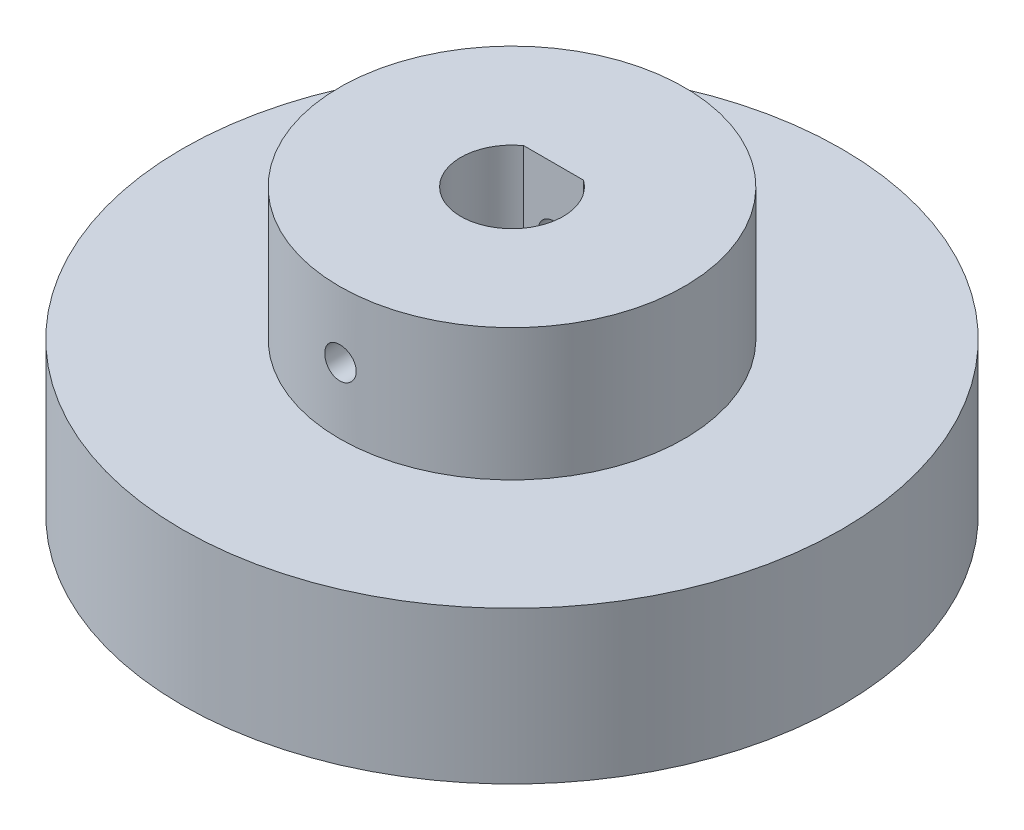
ISO-10303-21;
HEADER;
FILE_DESCRIPTION(('STEP AP214'),'2;1');
FILE_NAME('part.step','',(''),(''),'','','');
FILE_SCHEMA(('AUTOMOTIVE_DESIGN { 1 0 10303 214 1 1 1 1 }'));
ENDSEC;
DATA;
#1=APPLICATION_CONTEXT('core data for automotive mechanical design processes');
#2=APPLICATION_PROTOCOL_DEFINITION('international standard','automotive_design',2000,#1);
#3=PRODUCT_CONTEXT('',#1,'mechanical');
#4=PRODUCT('Part','Part','',(#3));
#5=PRODUCT_RELATED_PRODUCT_CATEGORY('part','',(#4));
#6=PRODUCT_DEFINITION_FORMATION('','',#4);
#7=PRODUCT_DEFINITION_CONTEXT('part definition',#1,'design');
#8=PRODUCT_DEFINITION('design','',#6,#7);
#9=PRODUCT_DEFINITION_SHAPE('','',#8);
#10=(LENGTH_UNIT() NAMED_UNIT(*) SI_UNIT(.MILLI.,.METRE.));
#11=(NAMED_UNIT(*) PLANE_ANGLE_UNIT() SI_UNIT($,.RADIAN.));
#12=(NAMED_UNIT(*) SI_UNIT($,.STERADIAN.) SOLID_ANGLE_UNIT());
#13=UNCERTAINTY_MEASURE_WITH_UNIT(LENGTH_MEASURE(1.E-05),#10,'distance_accuracy_value','');
#14=(GEOMETRIC_REPRESENTATION_CONTEXT(3) GLOBAL_UNCERTAINTY_ASSIGNED_CONTEXT((#13)) GLOBAL_UNIT_ASSIGNED_CONTEXT((#10,
#11,#12)) REPRESENTATION_CONTEXT('',''));
#15=CARTESIAN_POINT('',(0.,0.,0.));
#16=DIRECTION('',(0.,0.,1.));
#17=DIRECTION('',(1.,0.,0.));
#18=AXIS2_PLACEMENT_3D('',#15,#16,#17);
#19=CARTESIAN_POINT('',(0.0223703761253122,21.5,-32.5));
#20=DIRECTION('',(0.,0.,1.));
#21=DIRECTION('',(1.,0.,0.));
#22=AXIS2_PLACEMENT_3D('',#19,#20,#21);
#23=CYLINDRICAL_SURFACE('',#22,1.55);
#24=CARTESIAN_POINT('',(1.57237037612531,21.5,4.79897399454129));
#25=CARTESIAN_POINT('',(1.57236958554526,21.415245112854,4.79897468549828));
#26=CARTESIAN_POINT('',(1.56539491467317,21.3304823688655,4.80127644397122));
#27=CARTESIAN_POINT('',(1.53775875516251,21.1634440908538,4.81019780807847));
#28=CARTESIAN_POINT('',(1.51709314240551,21.0811693140913,4.81681871475932));
#29=CARTESIAN_POINT('',(1.46285396931085,20.9215525691871,4.83356548686396));
#30=CARTESIAN_POINT('',(1.42930316875579,20.8442021821046,4.84368516909074));
#31=CARTESIAN_POINT('',(1.35032356496765,20.6962092904023,4.86629295757356));
#32=CARTESIAN_POINT('',(1.30489276946151,20.6255679135934,4.87878146098394));
#33=CARTESIAN_POINT('',(1.20179053880469,20.4905941236095,4.90521266106346));
#34=CARTESIAN_POINT('',(1.14378480103254,20.426523478463,4.91918832794817));
#35=CARTESIAN_POINT('',(1.01789724733333,20.3088442005661,4.94676984753791));
#36=CARTESIAN_POINT('',(0.95001402931524,20.255237055625,4.960375647415));
#37=CARTESIAN_POINT('',(0.804371403675687,20.1588165257837,4.98608775331599));
#38=CARTESIAN_POINT('',(0.726420470532028,20.1162803122584,4.99815228427005));
#39=CARTESIAN_POINT('',(0.56403799125583,20.0450250246475,5.01906873581553));
#40=CARTESIAN_POINT('',(0.479607897562207,20.0163028642849,5.02792137388578));
#41=CARTESIAN_POINT('',(0.309312844167433,19.9743445301574,5.0412201368812));
#42=CARTESIAN_POINT('',(0.223564464358488,19.9606748502213,5.0457890188633));
#43=CARTESIAN_POINT('',(0.0508764378845257,19.9478468880424,5.05048168839274));
#44=CARTESIAN_POINT('',(-0.0360629344679921,19.9486853185907,5.05060648284997));
#45=CARTESIAN_POINT('',(-0.205503852231969,19.9645629012171,5.04650467193481));
#46=CARTESIAN_POINT('',(-0.288055375261147,19.9791143887754,5.04242704890238));
#47=CARTESIAN_POINT('',(-0.449493142819145,20.0212150463591,5.03060735909615));
#48=CARTESIAN_POINT('',(-0.528379171497621,20.0487649807624,5.02286507682075));
#49=CARTESIAN_POINT('',(-0.681252408272383,20.1163539116386,5.00443726482751));
#50=CARTESIAN_POINT('',(-0.755177580786521,20.1565244451335,4.99372088177117));
#51=CARTESIAN_POINT('',(-0.895390769856976,20.2481090976139,4.97049630395242));
#52=CARTESIAN_POINT('',(-0.961676937860915,20.2995259293889,4.95798767712328));
#53=CARTESIAN_POINT('',(-1.08751550858931,20.414548720774,4.93194745720397));
#54=CARTESIAN_POINT('',(-1.14669536187313,20.478558054921,4.918394965272));
#55=CARTESIAN_POINT('',(-1.25359530094817,20.6157081285505,4.89224236041931));
#56=CARTESIAN_POINT('',(-1.30131411044558,20.6888498836359,4.87964235367363));
#57=CARTESIAN_POINT('',(-1.38438978391308,20.843269704996,4.85673248512194));
#58=CARTESIAN_POINT('',(-1.41960339049295,20.9246291503289,4.84644962707734));
#59=CARTESIAN_POINT('',(-1.47571989170823,21.0925059162829,4.82966028921734));
#60=CARTESIAN_POINT('',(-1.49662753171737,21.1790215162152,4.8231525572794));
#61=CARTESIAN_POINT('',(-1.52284366888667,21.3512805927124,4.81493822038719));
#62=CARTESIAN_POINT('',(-1.52870750523541,21.4369314539227,4.81306079453928));
#63=CARTESIAN_POINT('',(-1.52622613541838,21.6079980310199,4.81384839018644));
#64=CARTESIAN_POINT('',(-1.51788298974906,21.6934137792067,4.81651275296748));
#65=CARTESIAN_POINT('',(-1.48772560866184,21.8591927026371,4.82591005186149));
#66=CARTESIAN_POINT('',(-1.46628049765534,21.9396300076588,4.83253139907249));
#67=CARTESIAN_POINT('',(-1.41095936316689,22.0957584690525,4.84897110778581));
#68=CARTESIAN_POINT('',(-1.37708138846456,22.1714488782597,4.8587899710808));
#69=CARTESIAN_POINT('',(-1.296805497858,22.3182050431409,4.88083680827539));
#70=CARTESIAN_POINT('',(-1.2500931129838,22.3890898348057,4.89312286834615));
#71=CARTESIAN_POINT('',(-1.14584018015968,22.5222212873612,4.91857951466367));
#72=CARTESIAN_POINT('',(-1.08829698718215,22.5844658317231,4.93175031646981));
#73=CARTESIAN_POINT('',(-0.961380494826282,22.7010149975381,4.95808424080737));
#74=CARTESIAN_POINT('',(-0.891637561241767,22.7549225837495,4.97122761855533));
#75=CARTESIAN_POINT('',(-0.743774720047935,22.8502810136936,4.99548832362483));
#76=CARTESIAN_POINT('',(-0.665655269968326,22.8917325373132,5.00660576151482));
#77=CARTESIAN_POINT('',(-0.503824430379552,22.9605769238491,5.02545872196002));
#78=CARTESIAN_POINT('',(-0.42016461099625,22.9880831818748,5.03322144422541));
#79=CARTESIAN_POINT('',(-0.249133552553757,23.0285620458291,5.04457791753595));
#80=CARTESIAN_POINT('',(-0.161763423240296,23.0415389661138,5.04817290616335));
#81=CARTESIAN_POINT('',(0.0104751742066859,23.0522588080119,5.0506945390149));
#82=CARTESIAN_POINT('',(0.0953050576053584,23.0505866984308,5.04980104546167));
#83=CARTESIAN_POINT('',(0.26340620193087,23.0334727239293,5.04382695603063));
#84=CARTESIAN_POINT('',(0.346677548357741,23.0180316166386,5.03874659053375));
#85=CARTESIAN_POINT('',(0.5084484834259,22.9741709878761,5.02498830543929));
#86=CARTESIAN_POINT('',(0.586989126143305,22.9458900205654,5.01634888134025));
#87=CARTESIAN_POINT('',(0.738243292571166,22.8772892321993,4.99633103163847));
#88=CARTESIAN_POINT('',(0.81095580468008,22.8369673268866,4.98495213190525));
#89=CARTESIAN_POINT('',(0.95117273254936,22.7438439982115,4.96014258619357));
#90=CARTESIAN_POINT('',(1.01841659467454,22.6906654374254,4.9466554075872));
#91=CARTESIAN_POINT('',(1.14322056559452,22.5740088436691,4.91931260332016));
#92=CARTESIAN_POINT('',(1.20077778284635,22.5105277463761,4.90545686906693));
#93=CARTESIAN_POINT('',(1.30640372500294,22.3726591002222,4.87840965396929));
#94=CARTESIAN_POINT('',(1.35411551697679,22.2979904956721,4.86525295500199));
#95=CARTESIAN_POINT('',(1.43625135952634,22.1412930734516,4.84164421670365));
#96=CARTESIAN_POINT('',(1.47068140462494,22.0592675968495,4.83119095791804));
#97=CARTESIAN_POINT('',(1.52244480658989,21.8983842070706,4.81511418166048));
#98=CARTESIAN_POINT('',(1.54111305144592,21.8199913828648,4.8091204098642));
#99=CARTESIAN_POINT('',(1.5660747817327,21.661067738215,4.80105044075344));
#100=CARTESIAN_POINT('',(1.57237112736547,21.5805374162933,4.79897333796688));
#101=CARTESIAN_POINT('',(1.57237037612531,21.5,4.79897399454129));
#102=B_SPLINE_CURVE_WITH_KNOTS('',3,(#24,#25,#26,#27,#28,#29,#30,#31,#32,#33,#34,#35,#36,#37,
#38,#39,#40,#41,#42,#43,#44,#45,#46,#47,#48,#49,#50,#51,#52,#53,#54,#55,#56,#57,#58,#59,#60,#61,
#62,#63,#64,#65,#66,#67,#68,#69,#70,#71,#72,#73,#74,#75,#76,#77,#78,#79,#80,#81,#82,#83,#84,#85,
#86,#87,#88,#89,#90,#91,#92,#93,#94,#95,#96,#97,#98,#99,#100,#101),.UNSPECIFIED.,.T.,.F.,(4,2,2,
2,2,2,2,2,2,2,2,2,2,2,2,2,2,2,2,2,2,2,2,2,2,2,2,2,2,2,2,2,2,2,2,2,2,2,4),(0.,0.253967035051624,
0.50801060732502,0.761607497756715,1.01524694364658,1.27670891970874,1.53820804611307,
1.80573262972291,2.07319741632902,2.33273969270848,2.5922231634627,2.84281375145303,
3.09341907734421,3.34672817173041,3.60009843589626,3.86354324925393,4.12701738605336,
4.39341923367813,4.65973267134037,4.91606366919113,5.17235749347987,5.42174385132853,
5.67116936475667,5.92735568440751,6.18360464953735,6.44970080365817,6.71578243086454,
6.97966425988961,7.24346771078181,7.49678642882717,7.7500912090444,8.00072527536826,
8.25140275101785,8.51058900074705,8.76985248299288,9.03730122887668,9.30462912404237,
9.54601436796691,9.78734380058715),.UNSPECIFIED.);
#103=CARTESIAN_POINT('',(1.57237037612531,21.5,4.79897399454129));
#104=VERTEX_POINT('',#103);
#105=EDGE_CURVE('E49',#104,#104,#102,.T.);
#106=ORIENTED_EDGE('',*,*,#105,.T.);
#107=EDGE_LOOP('',(#106));
#108=FACE_BOUND('',#107,.T.);
#109=CARTESIAN_POINT('',(1.57237037612531,21.5,16.9271276772016));
#110=CARTESIAN_POINT('',(1.57236659389507,21.4131369375683,16.9271286160672));
#111=CARTESIAN_POINT('',(1.56504398477038,21.3262154967159,16.927813181358));
#112=CARTESIAN_POINT('',(1.53594190994299,21.1547800174531,16.9304780710943));
#113=CARTESIAN_POINT('',(1.51414626348175,21.0702687840551,16.9324598457757));
#114=CARTESIAN_POINT('',(1.45673617165203,20.9061615515706,16.9374952407345));
#115=CARTESIAN_POINT('',(1.42112985250021,20.8265626939016,16.940548230607));
#116=CARTESIAN_POINT('',(1.33712440190627,20.6744895173705,16.9473852188164));
#117=CARTESIAN_POINT('',(1.28872791268835,20.6020137312446,16.9511690661276));
#118=CARTESIAN_POINT('',(1.18035334523799,20.4659994240568,16.9590600353723));
#119=CARTESIAN_POINT('',(1.12034350157623,20.4024862613564,16.9631680252336));
#120=CARTESIAN_POINT('',(0.990513462193653,20.2864179378318,16.9712434605172));
#121=CARTESIAN_POINT('',(0.920692823059478,20.2338632725599,16.9752108995768));
#122=CARTESIAN_POINT('',(0.773065204461031,20.1411144322338,16.9825744188427));
#123=CARTESIAN_POINT('',(0.69524375509448,20.1009431969604,16.9859694334507));
#124=CARTESIAN_POINT('',(0.533924077228444,20.0342474739556,16.9918048674329));
#125=CARTESIAN_POINT('',(0.450425964354821,20.0077227083585,16.9942453062438));
#126=CARTESIAN_POINT('',(0.280369303411096,19.9691449324961,16.9978999387046));
#127=CARTESIAN_POINT('',(0.193819920936012,19.9570518458503,16.9991175266794));
#128=CARTESIAN_POINT('',(0.0199116339372413,19.9475576927308,17.0002106846626));
#129=CARTESIAN_POINT('',(-0.067447252436503,19.9501562976456,17.0000862846875));
#130=CARTESIAN_POINT('',(-0.24021317022814,19.9699389179667,16.9985217032571));
#131=CARTESIAN_POINT('',(-0.325625351731892,19.9870783250333,16.9970855449887));
#132=CARTESIAN_POINT('',(-0.49235654375369,20.0353875218312,16.9930734075619));
#133=CARTESIAN_POINT('',(-0.573675511612227,20.0665574577552,16.9904974165269));
#134=CARTESIAN_POINT('',(-0.730039912174668,20.142086965524,16.984498185009));
#135=CARTESIAN_POINT('',(-0.805076648995674,20.1864644447953,16.9810737952892));
#136=CARTESIAN_POINT('',(-0.946653410689705,20.2871364137624,16.9737703628239));
#137=CARTESIAN_POINT('',(-1.01319323112513,20.3434311901042,16.9698913091435));
#138=CARTESIAN_POINT('',(-1.13613895409048,20.4665815858029,16.9621049668005));
#139=CARTESIAN_POINT('',(-1.19250742075607,20.5334745820691,16.9581976267623));
#140=CARTESIAN_POINT('',(-1.29322123653205,20.6757924486167,16.9508152319073));
#141=CARTESIAN_POINT('',(-1.33756656785388,20.7512173315209,16.9473401777301));
#142=CARTESIAN_POINT('',(-1.41297793258579,20.9084915223495,16.9412199119909));
#143=CARTESIAN_POINT('',(-1.44404083408563,20.9903423400883,16.9385748961856));
#144=CARTESIAN_POINT('',(-1.49197252860717,21.1581267407615,16.9344206245236));
#145=CARTESIAN_POINT('',(-1.50884166956168,21.2440602235628,16.9329113408267));
#146=CARTESIAN_POINT('',(-1.52786031686174,21.4172500365577,16.9312059669392));
#147=CARTESIAN_POINT('',(-1.53006091510152,21.5045007130984,16.9310053187027));
#148=CARTESIAN_POINT('',(-1.51981400386119,21.6781296444101,16.9319281483244));
#149=CARTESIAN_POINT('',(-1.50736665369941,21.7645079086597,16.9330516117808));
#150=CARTESIAN_POINT('',(-1.46822013129412,21.9337911593816,16.9364905064848));
#151=CARTESIAN_POINT('',(-1.44154514252187,22.0167017828618,16.9388039148828));
#152=CARTESIAN_POINT('',(-1.37472504960469,22.1768711626123,16.9443574224888));
#153=CARTESIAN_POINT('',(-1.33457969213555,22.2541298125582,16.9475975391244));
#154=CARTESIAN_POINT('',(-1.24182861900553,22.4010371413398,16.9546460471866));
#155=CARTESIAN_POINT('',(-1.18918869720926,22.4706641484312,16.9584559878271));
#156=CARTESIAN_POINT('',(-1.07299175906612,22.6001121643713,16.9662037685859));
#157=CARTESIAN_POINT('',(-1.00943452558874,22.6599329781419,16.9701416112467));
#158=CARTESIAN_POINT('',(-0.872987085440025,22.7682443807546,16.9777079357463));
#159=CARTESIAN_POINT('',(-0.800070599146281,22.8167019363281,16.9813354966358));
#160=CARTESIAN_POINT('',(-0.647104976640854,22.9006838791462,16.9878517596939));
#161=CARTESIAN_POINT('',(-0.567055926591044,22.9362084225962,16.9907404707861));
#162=CARTESIAN_POINT('',(-0.402223828917303,22.9932561067523,16.9954404972137));
#163=CARTESIAN_POINT('',(-0.317448339553714,23.0148009430332,16.9972534816291));
#164=CARTESIAN_POINT('',(-0.145466577955602,23.0433497597573,16.9995950455456));
#165=CARTESIAN_POINT('',(-0.0582603610377505,23.0503540708296,17.0001236542514));
#166=CARTESIAN_POINT('',(0.115775122087311,23.0496196257761,16.9998277007759));
#167=CARTESIAN_POINT('',(0.202604623089837,23.0419333822634,16.9990079598428));
#168=CARTESIAN_POINT('',(0.373732576635567,23.012146711158,16.9961069161588));
#169=CARTESIAN_POINT('',(0.458031024644318,22.9900462577436,16.9940256111479));
#170=CARTESIAN_POINT('',(0.621715811673158,22.9320698258438,16.9888251634667));
#171=CARTESIAN_POINT('',(0.701102044479991,22.8961935496145,16.9857059983647));
#172=CARTESIAN_POINT('',(0.852733337689036,22.8116900147118,16.9787694960184));
#173=CARTESIAN_POINT('',(0.924978475595245,22.7630628944471,16.9749521663526));
#174=CARTESIAN_POINT('',(1.0605550086033,22.6542338742117,16.9670226863364));
#175=CARTESIAN_POINT('',(1.12385395307,22.5939916200512,16.962909540424));
#176=CARTESIAN_POINT('',(1.23946961145082,22.4637191814367,16.9548542675677));
#177=CARTESIAN_POINT('',(1.29178367498071,22.3936866415992,16.9509121820782));
#178=CARTESIAN_POINT('',(1.38402788969073,22.2456627497164,16.9436306310379));
#179=CARTESIAN_POINT('',(1.42393150258732,22.167654809799,16.9402924631794));
#180=CARTESIAN_POINT('',(1.49002143558513,22.0060663925217,16.93460795458));
#181=CARTESIAN_POINT('',(1.51622340664177,21.9224923967086,16.9322604827924));
#182=CARTESIAN_POINT('',(1.54755282831842,21.7820280343358,16.9294188937738));
#183=CARTESIAN_POINT('',(1.55684687414475,21.7260391782835,16.9285636481783));
#184=CARTESIAN_POINT('',(1.56925687186279,21.6133751713036,16.927417734439));
#185=CARTESIAN_POINT('',(1.57237284498301,21.556700022735,16.9271270643553));
#186=CARTESIAN_POINT('',(1.57237037612531,21.5,16.9271276772016));
#187=B_SPLINE_CURVE_WITH_KNOTS('',3,(#109,#110,#111,#112,#113,#114,#115,#116,#117,#118,#119,
#120,#121,#122,#123,#124,#125,#126,#127,#128,#129,#130,#131,#132,#133,#134,#135,#136,#137,#138,
#139,#140,#141,#142,#143,#144,#145,#146,#147,#148,#149,#150,#151,#152,#153,#154,#155,#156,#157,
#158,#159,#160,#161,#162,#163,#164,#165,#166,#167,#168,#169,#170,#171,#172,#173,#174,#175,#176,
#177,#178,#179,#180,#181,#182,#183,#184,#185,#186),.UNSPECIFIED.,.T.,.F.,(4,2,2,2,2,2,2,2,2,2,2,
2,2,2,2,2,2,2,2,2,2,2,2,2,2,2,2,2,2,2,2,2,2,2,2,2,2,2,4),(0.,0.26038213175405,0.521055860205023,
0.781576440027273,1.04204324289158,1.3032328227842,1.56443421132373,1.82611659636994,
2.0877936529003,2.34874233572794,2.60968518189573,2.86983038913284,3.12997830704442,
3.3904805655557,3.65098909062576,3.9124376898775,4.17388667594743,4.43539727603145,
4.69690146549774,4.95749433350996,5.2180843672117,5.47823286722952,5.7383862598834,
5.99926025563522,6.26013944041727,6.52176785764677,6.78339311481494,7.04461136968713,
7.30582368479613,7.5661040207032,7.82638482288196,8.08667125095797,8.34695485377339,
8.60815960201618,8.86942730037112,9.13124990738562,9.3927727857402,9.56273828208302,
9.73270319440525),.UNSPECIFIED.);
#188=CARTESIAN_POINT('',(1.57237037612531,21.5,16.9271276772016));
#189=VERTEX_POINT('',#188);
#190=EDGE_CURVE('E118',#189,#189,#187,.T.);
#191=ORIENTED_EDGE('',*,*,#190,.F.);
#192=EDGE_LOOP('',(#191));
#193=FACE_BOUND('',#192,.T.);
#194=ADVANCED_FACE('F45',(#108,#193),#23,.F.);
#195=CARTESIAN_POINT('',(0.,15.,0.));
#196=DIRECTION('',(0.,-1.,0.));
#197=DIRECTION('',(0.,0.,-1.));
#198=AXIS2_PLACEMENT_3D('',#195,#196,#197);
#199=CYLINDRICAL_SURFACE('',#198,32.5);
#200=CARTESIAN_POINT('',(0.,15.,0.));
#201=DIRECTION('',(0.,1.,0.));
#202=DIRECTION('',(0.,0.,1.));
#203=AXIS2_PLACEMENT_3D('',#200,#201,#202);
#204=CIRCLE('',#203,32.5);
#205=CARTESIAN_POINT('',(0.,15.,32.5));
#206=VERTEX_POINT('',#205);
#207=EDGE_CURVE('E60',#206,#206,#204,.T.);
#208=ORIENTED_EDGE('',*,*,#207,.F.);
#209=EDGE_LOOP('',(#208));
#210=FACE_BOUND('',#209,.T.);
#211=CARTESIAN_POINT('',(0.,0.,0.));
#212=DIRECTION('',(0.,1.,0.));
#213=DIRECTION('',(0.,0.,1.));
#214=AXIS2_PLACEMENT_3D('',#211,#212,#213);
#215=CIRCLE('',#214,32.5);
#216=CARTESIAN_POINT('',(0.,0.,32.5));
#217=VERTEX_POINT('',#216);
#218=EDGE_CURVE('E109',#217,#217,#215,.T.);
#219=ORIENTED_EDGE('',*,*,#218,.T.);
#220=EDGE_LOOP('',(#219));
#221=FACE_BOUND('',#220,.T.);
#222=ADVANCED_FACE('F47',(#210,#221),#199,.T.);
#223=CARTESIAN_POINT('',(0.,15.,0.));
#224=DIRECTION('',(0.,1.,0.));
#225=DIRECTION('',(0.,0.,1.));
#226=AXIS2_PLACEMENT_3D('',#223,#224,#225);
#227=PLANE('',#226);
#228=CARTESIAN_POINT('',(0.,15.,0.));
#229=DIRECTION('',(0.,1.,0.));
#230=DIRECTION('',(0.,0.,1.));
#231=AXIS2_PLACEMENT_3D('',#228,#229,#230);
#232=CIRCLE('',#231,17.);
#233=CARTESIAN_POINT('',(0.,15.,17.));
#234=VERTEX_POINT('',#233);
#235=EDGE_CURVE('E11',#234,#234,#232,.T.);
#236=ORIENTED_EDGE('',*,*,#235,.F.);
#237=EDGE_LOOP('',(#236));
#238=FACE_BOUND('',#237,.T.);
#239=ORIENTED_EDGE('',*,*,#207,.T.);
#240=EDGE_LOOP('',(#239));
#241=FACE_BOUND('',#240,.T.);
#242=ADVANCED_FACE('F153',(#238,#241),#227,.T.);
#243=CARTESIAN_POINT('',(0.,0.,0.));
#244=DIRECTION('',(0.,1.,0.));
#245=DIRECTION('',(0.,0.,1.));
#246=AXIS2_PLACEMENT_3D('',#243,#244,#245);
#247=PLANE('',#246);
#248=DIRECTION('',(-1.,0.,0.));
#249=VECTOR('',#248,1.);
#250=CARTESIAN_POINT('',(-2.94830459756111,0.,-4.1));
#251=LINE('',#250,#249);
#252=CARTESIAN_POINT('',(2.94830459756111,0.,-4.1));
#253=VERTEX_POINT('',#252);
#254=CARTESIAN_POINT('',(-2.94830459756111,0.,-4.1));
#255=VERTEX_POINT('',#254);
#256=EDGE_CURVE('E101',#253,#255,#251,.T.);
#257=ORIENTED_EDGE('',*,*,#256,.T.);
#258=CARTESIAN_POINT('',(0.,0.,0.));
#259=DIRECTION('',(0.,1.,0.));
#260=DIRECTION('',(0.,0.,1.));
#261=AXIS2_PLACEMENT_3D('',#258,#259,#260);
#262=CIRCLE('',#261,5.05);
#263=EDGE_CURVE('E68',#255,#253,#262,.T.);
#264=ORIENTED_EDGE('',*,*,#263,.T.);
#265=EDGE_LOOP('',(#257,#264));
#266=FACE_BOUND('',#265,.T.);
#267=ORIENTED_EDGE('',*,*,#218,.F.);
#268=EDGE_LOOP('',(#267));
#269=FACE_BOUND('',#268,.T.);
#270=ADVANCED_FACE('F146',(#266,#269),#247,.F.);
#271=CARTESIAN_POINT('',(0.,28.,0.));
#272=DIRECTION('',(0.,-1.,0.));
#273=DIRECTION('',(0.,0.,-1.));
#274=AXIS2_PLACEMENT_3D('',#271,#272,#273);
#275=CYLINDRICAL_SURFACE('',#274,17.);
#276=CARTESIAN_POINT('',(0.,23.0498385613579,-17.));
#277=CARTESIAN_POINT('',(-0.0868663682931145,23.0485809508992,-16.999999085948));
#278=CARTESIAN_POINT('',(-0.173685468166951,23.0400023564061,-16.9993271238898));
#279=CARTESIAN_POINT('',(-0.344707744601173,23.0084202134858,-16.9967207129575));
#280=CARTESIAN_POINT('',(-0.42890787985605,22.9854005067209,-16.9947848497898));
#281=CARTESIAN_POINT('',(-0.592193791399683,22.9256096159576,-16.9898786232765));
#282=CARTESIAN_POINT('',(-0.671282521761873,22.8888464596986,-16.9869088639134));
#283=CARTESIAN_POINT('',(-0.822149705144904,22.8026259785611,-16.9802761854882));
#284=CARTESIAN_POINT('',(-0.893929672152452,22.7531712901952,-16.9766134104332));
#285=CARTESIAN_POINT('',(-1.02837517106396,22.642811113036,-16.9690010952066));
#286=CARTESIAN_POINT('',(-1.09101587904835,22.5818754306477,-16.9650508161402));
#287=CARTESIAN_POINT('',(-1.20519527854581,22.4503509730346,-16.9573225431791));
#288=CARTESIAN_POINT('',(-1.25673348281833,22.3797617743811,-16.9535445568514));
#289=CARTESIAN_POINT('',(-1.34732006017426,22.2307936577936,-16.9465867876863));
#290=CARTESIAN_POINT('',(-1.38634818747452,22.1524023792569,-16.9434079779213));
#291=CARTESIAN_POINT('',(-1.45067859753249,21.9901455896372,-16.9380217296697));
#292=CARTESIAN_POINT('',(-1.47598116932735,21.9062801938715,-16.9358142707283));
#293=CARTESIAN_POINT('',(-1.51207411902391,21.7357075294853,-16.9326301218829));
#294=CARTESIAN_POINT('',(-1.52290529221666,21.6490089585169,-16.9316499726502));
#295=CARTESIAN_POINT('',(-1.52987181906255,21.4750196072453,-16.9310219822187));
#296=CARTESIAN_POINT('',(-1.52600747647035,21.3877288392199,-16.9313741134818));
#297=CARTESIAN_POINT('',(-1.50372835769849,21.215290333189,-16.9333671492474));
#298=CARTESIAN_POINT('',(-1.48535442998087,21.1301372703261,-16.9350044356081));
#299=CARTESIAN_POINT('',(-1.43463824446335,20.9641278299129,-16.9393758951382));
#300=CARTESIAN_POINT('',(-1.40229581084244,20.8832715064599,-16.9421100821141));
#301=CARTESIAN_POINT('',(-1.32450288027309,20.7279991697681,-16.9483689478146));
#302=CARTESIAN_POINT('',(-1.27903088386855,20.6535939821276,-16.9518949209545));
#303=CARTESIAN_POINT('',(-1.17628646735206,20.513454987625,-16.9593335544481));
#304=CARTESIAN_POINT('',(-1.11901377168353,20.4477213833107,-16.9632462238303));
#305=CARTESIAN_POINT('',(-0.994054027222122,20.3265512417602,-16.971027666463));
#306=CARTESIAN_POINT('',(-0.926331193461506,20.2711515885173,-16.9748962378881));
#307=CARTESIAN_POINT('',(-0.782524081456846,20.1725031739418,-16.9821326906381));
#308=CARTESIAN_POINT('',(-0.706439813245747,20.1292543980295,-16.9855005725637));
#309=CARTESIAN_POINT('',(-0.548069499840979,20.0561498462738,-16.9913475211865));
#310=CARTESIAN_POINT('',(-0.465784437841992,20.0262919523763,-16.9938267284341));
#311=CARTESIAN_POINT('',(-0.297342125297643,19.9808247554211,-16.9976080434278));
#312=CARTESIAN_POINT('',(-0.211184971833435,19.9652150953404,-16.9989101806683));
#313=CARTESIAN_POINT('',(-0.0377761503553451,19.9487292819703,-17.0001783139702));
#314=CARTESIAN_POINT('',(0.049470466595981,19.9478003397034,-17.0001490987864));
#315=CARTESIAN_POINT('',(0.222875484735024,19.9605664554429,-16.9987601143463));
#316=CARTESIAN_POINT('',(0.309033895989288,19.9742613780695,-16.9974003574073));
#317=CARTESIAN_POINT('',(0.477694910982847,20.0158459758613,-16.9934963325209));
#318=CARTESIAN_POINT('',(0.560202505374396,20.0437155789388,-16.9909537399636));
#319=CARTESIAN_POINT('',(0.719371316140834,20.1128380454341,-16.9849596522805));
#320=CARTESIAN_POINT('',(0.796032413917998,20.1540911802513,-16.9815081387233));
#321=CARTESIAN_POINT('',(0.941585711299555,20.248955553168,-16.9740611150498));
#322=CARTESIAN_POINT('',(1.01045372236244,20.3026037766344,-16.9700639918089));
#323=CARTESIAN_POINT('',(1.138224988508,20.4206781762,-16.9619736688199));
#324=CARTESIAN_POINT('',(1.19712804462412,20.485104567452,-16.9578804671553));
#325=CARTESIAN_POINT('',(1.30346565906355,20.6231273864907,-16.9500394218847));
#326=CARTESIAN_POINT('',(1.35086720639278,20.6967493117131,-16.9462925910282));
#327=CARTESIAN_POINT('',(1.43263202076886,20.8509414870109,-16.9395766181439));
#328=CARTESIAN_POINT('',(1.46699546577037,20.9315116422327,-16.9366074655019));
#329=CARTESIAN_POINT('',(1.52164288769805,21.0971660949246,-16.9317854809396));
#330=CARTESIAN_POINT('',(1.54195188712807,21.182242077887,-16.9299306658359));
#331=CARTESIAN_POINT('',(1.56799644497224,21.3546137842347,-16.9275385453363));
#332=CARTESIAN_POINT('',(1.57373234867621,21.4419094549781,-16.9270012087247));
#333=CARTESIAN_POINT('',(1.5704694043828,21.6158971795699,-16.9273042093683));
#334=CARTESIAN_POINT('',(1.56152512794903,21.7025902713369,-16.9281394442908));
#335=CARTESIAN_POINT('',(1.5292659843916,21.8732371366565,-16.9310839713611));
#336=CARTESIAN_POINT('',(1.50595107793421,21.9571909027105,-16.9331932669961));
#337=CARTESIAN_POINT('',(1.44562035013057,22.1199977633744,-16.938450125427));
#338=CARTESIAN_POINT('',(1.40860277290617,22.1988502027716,-16.9415978212791));
#339=CARTESIAN_POINT('',(1.32192319485193,22.3492317641018,-16.9485811093666));
#340=CARTESIAN_POINT('',(1.27226132425316,22.4207609614506,-16.9524166945168));
#341=CARTESIAN_POINT('',(1.16148740198865,22.5547493530566,-16.9603665459843));
#342=CARTESIAN_POINT('',(1.10033413173983,22.6171744135455,-16.9644817803561));
#343=CARTESIAN_POINT('',(0.968397796387734,22.7309013347817,-16.9725238065442));
#344=CARTESIAN_POINT('',(0.897612421819803,22.7822005202321,-16.9764505528609));
#345=CARTESIAN_POINT('',(0.748266416282966,22.8722969603401,-16.9836890649089));
#346=CARTESIAN_POINT('',(0.669690076796141,22.9110682571304,-16.9869995478019));
#347=CARTESIAN_POINT('',(0.507164095422734,22.9748144904732,-16.9926269115898));
#348=CARTESIAN_POINT('',(0.423220705134557,22.9998051635286,-16.9949449251354));
#349=CARTESIAN_POINT('',(0.282325152106081,23.0290991276144,-16.9977466507787));
#350=CARTESIAN_POINT('',(0.226214092655529,23.0375821435074,-16.9985884447549));
#351=CARTESIAN_POINT('',(0.113395310776075,23.0483621979464,-16.9997154166614));
#352=CARTESIAN_POINT('',(0.0566875903887748,23.0506592576522,-17.0000005964956));
#353=CARTESIAN_POINT('',(0.,23.0498385613579,-17.));
#354=B_SPLINE_CURVE_WITH_KNOTS('',3,(#276,#277,#278,#279,#280,#281,#282,#283,#284,#285,#286,
#287,#288,#289,#290,#291,#292,#293,#294,#295,#296,#297,#298,#299,#300,#301,#302,#303,#304,#305,
#306,#307,#308,#309,#310,#311,#312,#313,#314,#315,#316,#317,#318,#319,#320,#321,#322,#323,#324,
#325,#326,#327,#328,#329,#330,#331,#332,#333,#334,#335,#336,#337,#338,#339,#340,#341,#342,#343,
#344,#345,#346,#347,#348,#349,#350,#351,#352,#353),.UNSPECIFIED.,.T.,.F.,(4,2,2,2,2,2,2,2,2,2,2,
2,2,2,2,2,2,2,2,2,2,2,2,2,2,2,2,2,2,2,2,2,2,2,2,2,2,2,4),(0.,0.260419390345292,
0.521130688129265,0.78168993816845,1.04219510392404,1.30339517844237,1.56460671356063,
1.82623887278435,2.08786552226019,2.34875307146917,2.60963522819117,2.86978553722183,
3.12993912084941,3.39052114157574,3.65110924780811,3.91261035767752,4.17411115377334,
4.43557057332874,4.69702344122152,4.95753596117937,5.21804606947467,5.47818830468169,
5.73833581553978,5.99926983425265,6.26020906232379,6.52188859224129,6.78356455041438,
7.04477341432122,7.30597608917893,7.56620997617718,7.82644457546241,8.08671253309969,
8.34697781019132,8.60819509880211,8.86947512952625,9.13129311342787,9.39281149717909,
9.56275757085786,9.7327030632189),.UNSPECIFIED.);
#355=CARTESIAN_POINT('',(0.,23.0498385613579,-17.));
#356=VERTEX_POINT('',#355);
#357=EDGE_CURVE('E110',#356,#356,#354,.T.);
#358=ORIENTED_EDGE('',*,*,#357,.T.);
#359=EDGE_LOOP('',(#358));
#360=FACE_BOUND('',#359,.T.);
#361=ORIENTED_EDGE('',*,*,#190,.T.);
#362=EDGE_LOOP('',(#361));
#363=FACE_BOUND('',#362,.T.);
#364=CARTESIAN_POINT('',(0.,28.,0.));
#365=DIRECTION('',(0.,1.,0.));
#366=DIRECTION('',(0.,0.,1.));
#367=AXIS2_PLACEMENT_3D('',#364,#365,#366);
#368=CIRCLE('',#367,17.);
#369=CARTESIAN_POINT('',(0.,28.,17.));
#370=VERTEX_POINT('',#369);
#371=EDGE_CURVE('E106',#370,#370,#368,.T.);
#372=ORIENTED_EDGE('',*,*,#371,.F.);
#373=EDGE_LOOP('',(#372));
#374=FACE_BOUND('',#373,.T.);
#375=ORIENTED_EDGE('',*,*,#235,.T.);
#376=EDGE_LOOP('',(#375));
#377=FACE_BOUND('',#376,.T.);
#378=ADVANCED_FACE('F129',(#360,#363,#374,#377),#275,.T.);
#379=CARTESIAN_POINT('',(0.,28.,0.));
#380=DIRECTION('',(0.,1.,0.));
#381=DIRECTION('',(0.,0.,1.));
#382=AXIS2_PLACEMENT_3D('',#379,#380,#381);
#383=PLANE('',#382);
#384=CARTESIAN_POINT('',(0.,28.,0.));
#385=DIRECTION('',(0.,1.,0.));
#386=DIRECTION('',(0.,0.,1.));
#387=AXIS2_PLACEMENT_3D('',#384,#385,#386);
#388=CIRCLE('',#387,5.05);
#389=CARTESIAN_POINT('',(-2.94830459756111,28.,-4.1));
#390=VERTEX_POINT('',#389);
#391=CARTESIAN_POINT('',(2.94830459756111,28.,-4.1));
#392=VERTEX_POINT('',#391);
#393=EDGE_CURVE('E73',#390,#392,#388,.T.);
#394=ORIENTED_EDGE('',*,*,#393,.F.);
#395=DIRECTION('',(-1.,0.,0.));
#396=VECTOR('',#395,1.);
#397=CARTESIAN_POINT('',(-2.94830459756111,28.,-4.1));
#398=LINE('',#397,#396);
#399=EDGE_CURVE('E90',#392,#390,#398,.T.);
#400=ORIENTED_EDGE('',*,*,#399,.F.);
#401=EDGE_LOOP('',(#394,#400));
#402=FACE_BOUND('',#401,.T.);
#403=ORIENTED_EDGE('',*,*,#371,.T.);
#404=EDGE_LOOP('',(#403));
#405=FACE_BOUND('',#404,.T.);
#406=ADVANCED_FACE('F96',(#402,#405),#383,.T.);
#407=CARTESIAN_POINT('',(0.0223703761253122,21.5,-4.1));
#408=DIRECTION('',(0.,0.,-1.));
#409=DIRECTION('',(-1.,0.,0.));
#410=AXIS2_PLACEMENT_3D('',#407,#408,#409);
#411=CIRCLE('',#410,1.55);
#412=CARTESIAN_POINT('',(-1.52762962387469,21.5,-4.1));
#413=VERTEX_POINT('',#412);
#414=EDGE_CURVE('E86',#413,#413,#411,.F.);
#415=ORIENTED_EDGE('',*,*,#414,.T.);
#416=EDGE_LOOP('',(#415));
#417=FACE_BOUND('',#416,.T.);
#418=ORIENTED_EDGE('',*,*,#357,.F.);
#419=EDGE_LOOP('',(#418));
#420=FACE_BOUND('',#419,.T.);
#421=ADVANCED_FACE('F133',(#417,#420),#23,.F.);
#422=CARTESIAN_POINT('',(0.,0.,0.));
#423=DIRECTION('',(0.,1.,0.));
#424=DIRECTION('',(0.,0.,1.));
#425=AXIS2_PLACEMENT_3D('',#422,#423,#424);
#426=CYLINDRICAL_SURFACE('',#425,5.05);
#427=ORIENTED_EDGE('',*,*,#393,.T.);
#428=DIRECTION('',(0.,1.,0.));
#429=VECTOR('',#428,1.);
#430=CARTESIAN_POINT('',(2.94830459756111,0.,-4.1));
#431=LINE('',#430,#429);
#432=EDGE_CURVE('E87',#253,#392,#431,.T.);
#433=ORIENTED_EDGE('',*,*,#432,.F.);
#434=ORIENTED_EDGE('',*,*,#263,.F.);
#435=DIRECTION('',(0.,1.,0.));
#436=VECTOR('',#435,1.);
#437=CARTESIAN_POINT('',(-2.94830459756111,0.,-4.1));
#438=LINE('',#437,#436);
#439=EDGE_CURVE('E78',#255,#390,#438,.T.);
#440=ORIENTED_EDGE('',*,*,#439,.T.);
#441=EDGE_LOOP('',(#427,#433,#434,#440));
#442=FACE_BOUND('',#441,.T.);
#443=ORIENTED_EDGE('',*,*,#105,.F.);
#444=EDGE_LOOP('',(#443));
#445=FACE_BOUND('',#444,.T.);
#446=ADVANCED_FACE('F80',(#442,#445),#426,.F.);
#447=CARTESIAN_POINT('',(-2.94830459756111,0.,-4.1));
#448=DIRECTION('',(0.,0.,-1.));
#449=DIRECTION('',(-1.,0.,0.));
#450=AXIS2_PLACEMENT_3D('',#447,#448,#449);
#451=PLANE('',#450);
#452=ORIENTED_EDGE('',*,*,#399,.T.);
#453=ORIENTED_EDGE('',*,*,#439,.F.);
#454=ORIENTED_EDGE('',*,*,#256,.F.);
#455=ORIENTED_EDGE('',*,*,#432,.T.);
#456=EDGE_LOOP('',(#452,#453,#454,#455));
#457=FACE_BOUND('',#456,.T.);
#458=ORIENTED_EDGE('',*,*,#414,.F.);
#459=EDGE_LOOP('',(#458));
#460=FACE_BOUND('',#459,.T.);
#461=ADVANCED_FACE('F91',(#457,#460),#451,.F.);
#462=CLOSED_SHELL('',(#194,#222,#242,#270,#378,#406,#421,#446,#461));
#463=MANIFOLD_SOLID_BREP('B2',#462);
#464=ADVANCED_BREP_SHAPE_REPRESENTATION('',(#18,#463),#14);
#465=SHAPE_DEFINITION_REPRESENTATION(#9,#464);
ENDSEC;
END-ISO-10303-21;
